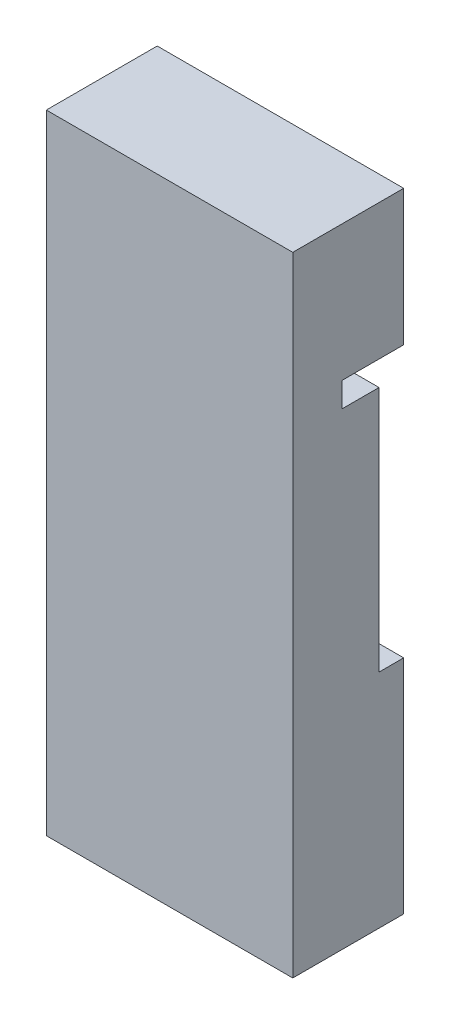
ISO-10303-21;
HEADER;
FILE_DESCRIPTION(('STEP AP214'),'2;1');
FILE_NAME('part.step','',(''),(''),'','','');
FILE_SCHEMA(('AUTOMOTIVE_DESIGN { 1 0 10303 214 1 1 1 1 }'));
ENDSEC;
DATA;
#1=APPLICATION_CONTEXT('core data for automotive mechanical design processes');
#2=APPLICATION_PROTOCOL_DEFINITION('international standard','automotive_design',2000,#1);
#3=PRODUCT_CONTEXT('',#1,'mechanical');
#4=PRODUCT('Part','Part','',(#3));
#5=PRODUCT_RELATED_PRODUCT_CATEGORY('part','',(#4));
#6=PRODUCT_DEFINITION_FORMATION('','',#4);
#7=PRODUCT_DEFINITION_CONTEXT('part definition',#1,'design');
#8=PRODUCT_DEFINITION('design','',#6,#7);
#9=PRODUCT_DEFINITION_SHAPE('','',#8);
#10=(LENGTH_UNIT() NAMED_UNIT(*) SI_UNIT(.MILLI.,.METRE.));
#11=(NAMED_UNIT(*) PLANE_ANGLE_UNIT() SI_UNIT($,.RADIAN.));
#12=(NAMED_UNIT(*) SI_UNIT($,.STERADIAN.) SOLID_ANGLE_UNIT());
#13=UNCERTAINTY_MEASURE_WITH_UNIT(LENGTH_MEASURE(1.E-05),#10,'distance_accuracy_value','');
#14=(GEOMETRIC_REPRESENTATION_CONTEXT(3) GLOBAL_UNCERTAINTY_ASSIGNED_CONTEXT((#13)) GLOBAL_UNIT_ASSIGNED_CONTEXT((#10,
#11,#12)) REPRESENTATION_CONTEXT('',''));
#15=CARTESIAN_POINT('',(0.,0.,0.));
#16=DIRECTION('',(0.,0.,1.));
#17=DIRECTION('',(1.,0.,0.));
#18=AXIS2_PLACEMENT_3D('',#15,#16,#17);
#19=CARTESIAN_POINT('',(-15.9031235431236,-45.9115384615385,0.));
#20=DIRECTION('',(0.,0.,1.));
#21=DIRECTION('',(1.,0.,0.));
#22=AXIS2_PLACEMENT_3D('',#19,#20,#21);
#23=PLANE('',#22);
#24=DIRECTION('',(0.,1.,0.));
#25=VECTOR('',#24,1.);
#26=CARTESIAN_POINT('',(4.09687645687643,5.08846153846154,0.));
#27=LINE('',#26,#25);
#28=CARTESIAN_POINT('',(4.09687645687643,-5.91153846153853,0.));
#29=VERTEX_POINT('',#28);
#30=CARTESIAN_POINT('',(4.09687645687643,5.08846153846154,0.));
#31=VERTEX_POINT('',#30);
#32=EDGE_CURVE('E65',#29,#31,#27,.T.);
#33=ORIENTED_EDGE('',*,*,#32,.F.);
#34=DIRECTION('',(1.,0.,0.));
#35=VECTOR('',#34,1.);
#36=CARTESIAN_POINT('',(-15.9041235431236,-5.91153846153853,0.));
#37=LINE('',#36,#35);
#38=CARTESIAN_POINT('',(-15.9031235431236,-5.91153846153853,0.));
#39=VERTEX_POINT('',#38);
#40=EDGE_CURVE('E156',#39,#29,#37,.T.);
#41=ORIENTED_EDGE('',*,*,#40,.F.);
#42=DIRECTION('',(0.,-1.,0.));
#43=VECTOR('',#42,1.);
#44=CARTESIAN_POINT('',(-15.9031235431236,5.08846153846154,0.));
#45=LINE('',#44,#43);
#46=CARTESIAN_POINT('',(-15.9031235431236,5.08846153846154,0.));
#47=VERTEX_POINT('',#46);
#48=EDGE_CURVE('E189',#47,#39,#45,.T.);
#49=ORIENTED_EDGE('',*,*,#48,.F.);
#50=DIRECTION('',(-1.,0.,0.));
#51=VECTOR('',#50,1.);
#52=CARTESIAN_POINT('',(-15.9031235431236,5.08846153846154,0.));
#53=LINE('',#52,#51);
#54=EDGE_CURVE('E71',#31,#47,#53,.T.);
#55=ORIENTED_EDGE('',*,*,#54,.F.);
#56=EDGE_LOOP('',(#33,#41,#49,#55));
#57=FACE_BOUND('',#56,.T.);
#58=ADVANCED_FACE('F30',(#57),#23,.F.);
#59=CARTESIAN_POINT('',(-15.9031235431236,5.08846153846154,9.));
#60=DIRECTION('',(1.,0.,0.));
#61=DIRECTION('',(0.,1.,0.));
#62=AXIS2_PLACEMENT_3D('',#59,#60,#61);
#63=PLANE('',#62);
#64=ORIENTED_EDGE('',*,*,#48,.T.);
#65=DIRECTION('',(0.,0.,-1.));
#66=VECTOR('',#65,1.);
#67=CARTESIAN_POINT('',(-15.9031235431236,-5.91153846153853,4.99999999999999));
#68=LINE('',#67,#66);
#69=CARTESIAN_POINT('',(-15.9031235431236,-5.91153846153853,4.99999999999999));
#70=VERTEX_POINT('',#69);
#71=EDGE_CURVE('E146',#70,#39,#68,.T.);
#72=ORIENTED_EDGE('',*,*,#71,.F.);
#73=DIRECTION('',(0.,1.,0.));
#74=VECTOR('',#73,1.);
#75=CARTESIAN_POINT('',(-15.9031235431236,-5.91153846153853,4.99999999999999));
#76=LINE('',#75,#74);
#77=CARTESIAN_POINT('',(-15.9031235431236,-7.91153846153853,4.99999999999999));
#78=VERTEX_POINT('',#77);
#79=EDGE_CURVE('E127',#78,#70,#76,.T.);
#80=ORIENTED_EDGE('',*,*,#79,.F.);
#81=DIRECTION('',(0.,0.,1.));
#82=VECTOR('',#81,1.);
#83=CARTESIAN_POINT('',(-15.9031235431236,-7.91153846153853,4.99999999999999));
#84=LINE('',#83,#82);
#85=CARTESIAN_POINT('',(-15.9031235431236,-7.91153846153853,0.));
#86=VERTEX_POINT('',#85);
#87=EDGE_CURVE('E137',#86,#78,#84,.T.);
#88=ORIENTED_EDGE('',*,*,#87,.F.);
#89=CARTESIAN_POINT('',(-15.9031235431236,-45.9115384615385,0.));
#90=VERTEX_POINT('',#89);
#91=EDGE_CURVE('E178',#86,#90,#45,.T.);
#92=ORIENTED_EDGE('',*,*,#91,.T.);
#93=DIRECTION('',(0.,0.,-1.));
#94=VECTOR('',#93,1.);
#95=CARTESIAN_POINT('',(-15.9031235431236,-45.9115384615385,9.));
#96=LINE('',#95,#94);
#97=CARTESIAN_POINT('',(-15.9031235431236,-45.9115384615385,9.));
#98=VERTEX_POINT('',#97);
#99=EDGE_CURVE('E11',#98,#90,#96,.T.);
#100=ORIENTED_EDGE('',*,*,#99,.F.);
#101=DIRECTION('',(0.,-1.,0.));
#102=VECTOR('',#101,1.);
#103=CARTESIAN_POINT('',(-15.9031235431236,5.08846153846154,9.));
#104=LINE('',#103,#102);
#105=CARTESIAN_POINT('',(-15.9031235431236,5.08846153846154,9.));
#106=VERTEX_POINT('',#105);
#107=EDGE_CURVE('E182',#106,#98,#104,.T.);
#108=ORIENTED_EDGE('',*,*,#107,.F.);
#109=DIRECTION('',(0.,0.,-1.));
#110=VECTOR('',#109,1.);
#111=CARTESIAN_POINT('',(-15.9031235431236,5.08846153846154,9.));
#112=LINE('',#111,#110);
#113=EDGE_CURVE('E188',#106,#47,#112,.T.);
#114=ORIENTED_EDGE('',*,*,#113,.T.);
#115=EDGE_LOOP('',(#64,#72,#80,#88,#92,#100,#108,#114));
#116=FACE_BOUND('',#115,.T.);
#117=ADVANCED_FACE('F32',(#116),#63,.F.);
#118=CARTESIAN_POINT('',(-15.9031235431236,-45.9115384615385,9.));
#119=DIRECTION('',(0.,1.,0.));
#120=DIRECTION('',(0.,0.,1.));
#121=AXIS2_PLACEMENT_3D('',#118,#119,#120);
#122=PLANE('',#121);
#123=DIRECTION('',(1.,0.,0.));
#124=VECTOR('',#123,1.);
#125=CARTESIAN_POINT('',(-15.9031235431236,-45.9115384615385,0.));
#126=LINE('',#125,#124);
#127=CARTESIAN_POINT('',(4.09687645687644,-45.9115384615385,0.));
#128=VERTEX_POINT('',#127);
#129=EDGE_CURVE('E191',#90,#128,#126,.T.);
#130=ORIENTED_EDGE('',*,*,#129,.T.);
#131=DIRECTION('',(0.,0.,-1.));
#132=VECTOR('',#131,1.);
#133=CARTESIAN_POINT('',(4.09687645687644,-45.9115384615385,9.));
#134=LINE('',#133,#132);
#135=CARTESIAN_POINT('',(4.09687645687644,-45.9115384615385,9.));
#136=VERTEX_POINT('',#135);
#137=EDGE_CURVE('E39',#136,#128,#134,.T.);
#138=ORIENTED_EDGE('',*,*,#137,.F.);
#139=DIRECTION('',(1.,0.,0.));
#140=VECTOR('',#139,1.);
#141=CARTESIAN_POINT('',(-15.9031235431236,-45.9115384615385,9.));
#142=LINE('',#141,#140);
#143=EDGE_CURVE('E78',#98,#136,#142,.T.);
#144=ORIENTED_EDGE('',*,*,#143,.F.);
#145=ORIENTED_EDGE('',*,*,#99,.T.);
#146=EDGE_LOOP('',(#130,#138,#144,#145));
#147=FACE_BOUND('',#146,.T.);
#148=ADVANCED_FACE('F236',(#147),#122,.F.);
#149=CARTESIAN_POINT('',(4.09687645687643,5.08846153846154,9.));
#150=DIRECTION('',(-1.,0.,0.));
#151=DIRECTION('',(0.,-1.,0.));
#152=AXIS2_PLACEMENT_3D('',#149,#150,#151);
#153=PLANE('',#152);
#154=DIRECTION('',(0.,-1.,0.));
#155=VECTOR('',#154,1.);
#156=CARTESIAN_POINT('',(4.09687645687643,-5.91153846153853,4.99999999999999));
#157=LINE('',#156,#155);
#158=CARTESIAN_POINT('',(4.09687645687643,-5.91153846153853,4.99999999999999));
#159=VERTEX_POINT('',#158);
#160=CARTESIAN_POINT('',(4.09687645687643,-7.91153846153852,4.99999999999999));
#161=VERTEX_POINT('',#160);
#162=EDGE_CURVE('E130',#159,#161,#157,.T.);
#163=ORIENTED_EDGE('',*,*,#162,.F.);
#164=DIRECTION('',(0.,0.,1.));
#165=VECTOR('',#164,1.);
#166=CARTESIAN_POINT('',(4.09687645687643,-5.91153846153853,4.99999999999999));
#167=LINE('',#166,#165);
#168=EDGE_CURVE('E134',#29,#159,#167,.T.);
#169=ORIENTED_EDGE('',*,*,#168,.F.);
#170=ORIENTED_EDGE('',*,*,#32,.T.);
#171=DIRECTION('',(0.,0.,-1.));
#172=VECTOR('',#171,1.);
#173=CARTESIAN_POINT('',(4.09687645687643,5.08846153846154,9.));
#174=LINE('',#173,#172);
#175=CARTESIAN_POINT('',(4.09687645687643,5.08846153846154,9.));
#176=VERTEX_POINT('',#175);
#177=EDGE_CURVE('E198',#176,#31,#174,.T.);
#178=ORIENTED_EDGE('',*,*,#177,.F.);
#179=DIRECTION('',(0.,1.,0.));
#180=VECTOR('',#179,1.);
#181=CARTESIAN_POINT('',(4.09687645687643,5.08846153846154,9.));
#182=LINE('',#181,#180);
#183=EDGE_CURVE('E185',#136,#176,#182,.T.);
#184=ORIENTED_EDGE('',*,*,#183,.F.);
#185=ORIENTED_EDGE('',*,*,#137,.T.);
#186=CARTESIAN_POINT('',(4.09687645687644,-27.9115384615385,0.));
#187=VERTEX_POINT('',#186);
#188=EDGE_CURVE('E193',#128,#187,#27,.T.);
#189=ORIENTED_EDGE('',*,*,#188,.T.);
#190=DIRECTION('',(0.,0.,-1.));
#191=VECTOR('',#190,1.);
#192=CARTESIAN_POINT('',(4.09687645687644,-27.9115384615385,2.));
#193=LINE('',#192,#191);
#194=CARTESIAN_POINT('',(4.09687645687644,-27.9115384615385,2.));
#195=VERTEX_POINT('',#194);
#196=EDGE_CURVE('E179',#195,#187,#193,.T.);
#197=ORIENTED_EDGE('',*,*,#196,.F.);
#198=DIRECTION('',(0.,-1.,0.));
#199=VECTOR('',#198,1.);
#200=CARTESIAN_POINT('',(4.09687645687644,-7.91153846153852,2.));
#201=LINE('',#200,#199);
#202=CARTESIAN_POINT('',(4.09687645687644,-7.91153846153852,2.));
#203=VERTEX_POINT('',#202);
#204=EDGE_CURVE('E166',#203,#195,#201,.T.);
#205=ORIENTED_EDGE('',*,*,#204,.F.);
#206=DIRECTION('',(0.,0.,-1.));
#207=VECTOR('',#206,1.);
#208=CARTESIAN_POINT('',(4.09687645687643,-7.91153846153852,4.99999999999999));
#209=LINE('',#208,#207);
#210=EDGE_CURVE('E151',#161,#203,#209,.T.);
#211=ORIENTED_EDGE('',*,*,#210,.F.);
#212=EDGE_LOOP('',(#163,#169,#170,#178,#184,#185,#189,#197,#205,#211));
#213=FACE_BOUND('',#212,.T.);
#214=ADVANCED_FACE('F202',(#213),#153,.F.);
#215=CARTESIAN_POINT('',(-15.9031235431236,5.08846153846154,9.));
#216=DIRECTION('',(0.,-1.,0.));
#217=DIRECTION('',(0.,0.,-1.));
#218=AXIS2_PLACEMENT_3D('',#215,#216,#217);
#219=PLANE('',#218);
#220=ORIENTED_EDGE('',*,*,#54,.T.);
#221=ORIENTED_EDGE('',*,*,#113,.F.);
#222=DIRECTION('',(-1.,0.,0.));
#223=VECTOR('',#222,1.);
#224=CARTESIAN_POINT('',(-15.9031235431236,5.08846153846154,9.));
#225=LINE('',#224,#223);
#226=EDGE_CURVE('E47',#176,#106,#225,.T.);
#227=ORIENTED_EDGE('',*,*,#226,.F.);
#228=ORIENTED_EDGE('',*,*,#177,.T.);
#229=EDGE_LOOP('',(#220,#221,#227,#228));
#230=FACE_BOUND('',#229,.T.);
#231=ADVANCED_FACE('F238',(#230),#219,.F.);
#232=CARTESIAN_POINT('',(-15.9031235431236,-45.9115384615385,9.));
#233=DIRECTION('',(0.,0.,1.));
#234=DIRECTION('',(1.,0.,0.));
#235=AXIS2_PLACEMENT_3D('',#232,#233,#234);
#236=PLANE('',#235);
#237=ORIENTED_EDGE('',*,*,#107,.T.);
#238=ORIENTED_EDGE('',*,*,#143,.T.);
#239=ORIENTED_EDGE('',*,*,#183,.T.);
#240=ORIENTED_EDGE('',*,*,#226,.T.);
#241=EDGE_LOOP('',(#237,#238,#239,#240));
#242=FACE_BOUND('',#241,.T.);
#243=ADVANCED_FACE('F227',(#242),#236,.T.);
#244=ORIENTED_EDGE('',*,*,#91,.F.);
#245=DIRECTION('',(1.,0.,0.));
#246=VECTOR('',#245,1.);
#247=CARTESIAN_POINT('',(-15.9041235431236,-7.91153846153853,0.));
#248=LINE('',#247,#246);
#249=CARTESIAN_POINT('',(-2.90312354312355,-7.91153846153853,0.));
#250=VERTEX_POINT('',#249);
#251=EDGE_CURVE('E133',#86,#250,#248,.T.);
#252=ORIENTED_EDGE('',*,*,#251,.T.);
#253=DIRECTION('',(0.,1.,0.));
#254=VECTOR('',#253,1.);
#255=CARTESIAN_POINT('',(-2.90312354312355,-7.91153846153852,0.));
#256=LINE('',#255,#254);
#257=CARTESIAN_POINT('',(-2.90312354312355,-27.9115384615385,0.));
#258=VERTEX_POINT('',#257);
#259=EDGE_CURVE('E142',#258,#250,#256,.T.);
#260=ORIENTED_EDGE('',*,*,#259,.F.);
#261=DIRECTION('',(-1.,0.,0.));
#262=VECTOR('',#261,1.);
#263=CARTESIAN_POINT('',(-2.90312354312355,-27.9115384615385,0.));
#264=LINE('',#263,#262);
#265=EDGE_CURVE('E163',#187,#258,#264,.T.);
#266=ORIENTED_EDGE('',*,*,#265,.F.);
#267=ORIENTED_EDGE('',*,*,#188,.F.);
#268=ORIENTED_EDGE('',*,*,#129,.F.);
#269=EDGE_LOOP('',(#244,#252,#260,#266,#267,#268));
#270=FACE_BOUND('',#269,.T.);
#271=ADVANCED_FACE('F207',(#270),#23,.F.);
#272=CARTESIAN_POINT('',(-2.90312354312355,-7.91153846153852,2.));
#273=DIRECTION('',(-1.,0.,0.));
#274=DIRECTION('',(0.,0.,1.));
#275=AXIS2_PLACEMENT_3D('',#272,#273,#274);
#276=PLANE('',#275);
#277=ORIENTED_EDGE('',*,*,#259,.T.);
#278=DIRECTION('',(0.,0.,-1.));
#279=VECTOR('',#278,1.);
#280=CARTESIAN_POINT('',(-2.90312354312355,-7.91153846153852,2.));
#281=LINE('',#280,#279);
#282=CARTESIAN_POINT('',(-2.90312354312355,-7.91153846153852,2.));
#283=VERTEX_POINT('',#282);
#284=EDGE_CURVE('E171',#283,#250,#281,.T.);
#285=ORIENTED_EDGE('',*,*,#284,.F.);
#286=DIRECTION('',(0.,1.,0.));
#287=VECTOR('',#286,1.);
#288=CARTESIAN_POINT('',(-2.90312354312355,-7.91153846153852,2.));
#289=LINE('',#288,#287);
#290=CARTESIAN_POINT('',(-2.90312354312355,-27.9115384615385,2.));
#291=VERTEX_POINT('',#290);
#292=EDGE_CURVE('E159',#291,#283,#289,.T.);
#293=ORIENTED_EDGE('',*,*,#292,.F.);
#294=DIRECTION('',(0.,0.,-1.));
#295=VECTOR('',#294,1.);
#296=CARTESIAN_POINT('',(-2.90312354312355,-27.9115384615385,2.));
#297=LINE('',#296,#295);
#298=EDGE_CURVE('E176',#291,#258,#297,.T.);
#299=ORIENTED_EDGE('',*,*,#298,.T.);
#300=EDGE_LOOP('',(#277,#285,#293,#299));
#301=FACE_BOUND('',#300,.T.);
#302=ADVANCED_FACE('F218',(#301),#276,.F.);
#303=CARTESIAN_POINT('',(-2.90312354312355,-27.9115384615385,2.));
#304=DIRECTION('',(0.,-1.,0.));
#305=DIRECTION('',(0.,0.,-1.));
#306=AXIS2_PLACEMENT_3D('',#303,#304,#305);
#307=PLANE('',#306);
#308=ORIENTED_EDGE('',*,*,#265,.T.);
#309=ORIENTED_EDGE('',*,*,#298,.F.);
#310=DIRECTION('',(-1.,0.,0.));
#311=VECTOR('',#310,1.);
#312=CARTESIAN_POINT('',(-2.90312354312355,-27.9115384615385,2.));
#313=LINE('',#312,#311);
#314=EDGE_CURVE('E168',#195,#291,#313,.T.);
#315=ORIENTED_EDGE('',*,*,#314,.F.);
#316=ORIENTED_EDGE('',*,*,#196,.T.);
#317=EDGE_LOOP('',(#308,#309,#315,#316));
#318=FACE_BOUND('',#317,.T.);
#319=ADVANCED_FACE('F210',(#318),#307,.F.);
#320=CARTESIAN_POINT('',(-2.90312354312355,-27.9115384615385,2.));
#321=DIRECTION('',(0.,0.,1.));
#322=DIRECTION('',(1.,0.,0.));
#323=AXIS2_PLACEMENT_3D('',#320,#321,#322);
#324=PLANE('',#323);
#325=ORIENTED_EDGE('',*,*,#292,.T.);
#326=DIRECTION('',(1.,0.,0.));
#327=VECTOR('',#326,1.);
#328=CARTESIAN_POINT('',(-2.90312354312355,-7.91153846153852,2.));
#329=LINE('',#328,#327);
#330=EDGE_CURVE('E162',#283,#203,#329,.T.);
#331=ORIENTED_EDGE('',*,*,#330,.T.);
#332=ORIENTED_EDGE('',*,*,#204,.T.);
#333=ORIENTED_EDGE('',*,*,#314,.T.);
#334=EDGE_LOOP('',(#325,#331,#332,#333));
#335=FACE_BOUND('',#334,.T.);
#336=ADVANCED_FACE('F215',(#335),#324,.F.);
#337=CARTESIAN_POINT('',(-15.9041235431236,-7.91153846153853,4.99999999999999));
#338=DIRECTION('',(0.,-1.,0.));
#339=DIRECTION('',(1.,0.,0.));
#340=AXIS2_PLACEMENT_3D('',#337,#338,#339);
#341=PLANE('',#340);
#342=ORIENTED_EDGE('',*,*,#251,.F.);
#343=ORIENTED_EDGE('',*,*,#87,.T.);
#344=DIRECTION('',(1.,0.,0.));
#345=VECTOR('',#344,1.);
#346=CARTESIAN_POINT('',(-15.9041235431236,-7.91153846153853,4.99999999999999));
#347=LINE('',#346,#345);
#348=EDGE_CURVE('E123',#78,#161,#347,.T.);
#349=ORIENTED_EDGE('',*,*,#348,.T.);
#350=ORIENTED_EDGE('',*,*,#210,.T.);
#351=ORIENTED_EDGE('',*,*,#330,.F.);
#352=ORIENTED_EDGE('',*,*,#284,.T.);
#353=EDGE_LOOP('',(#342,#343,#349,#350,#351,#352));
#354=FACE_BOUND('',#353,.T.);
#355=ADVANCED_FACE('F138',(#354),#341,.F.);
#356=CARTESIAN_POINT('',(-15.9041235431236,-5.91153846153853,4.99999999999999));
#357=DIRECTION('',(0.,0.,1.));
#358=DIRECTION('',(1.,0.,0.));
#359=AXIS2_PLACEMENT_3D('',#356,#357,#358);
#360=PLANE('',#359);
#361=ORIENTED_EDGE('',*,*,#79,.T.);
#362=DIRECTION('',(1.,0.,0.));
#363=VECTOR('',#362,1.);
#364=CARTESIAN_POINT('',(-15.9041235431236,-5.91153846153853,4.99999999999999));
#365=LINE('',#364,#363);
#366=EDGE_CURVE('E143',#70,#159,#365,.T.);
#367=ORIENTED_EDGE('',*,*,#366,.T.);
#368=ORIENTED_EDGE('',*,*,#162,.T.);
#369=ORIENTED_EDGE('',*,*,#348,.F.);
#370=EDGE_LOOP('',(#361,#367,#368,#369));
#371=FACE_BOUND('',#370,.T.);
#372=ADVANCED_FACE('F125',(#371),#360,.F.);
#373=CARTESIAN_POINT('',(-15.9041235431236,-5.91153846153853,4.99999999999999));
#374=DIRECTION('',(0.,1.,0.));
#375=DIRECTION('',(-1.,0.,0.));
#376=AXIS2_PLACEMENT_3D('',#373,#374,#375);
#377=PLANE('',#376);
#378=ORIENTED_EDGE('',*,*,#71,.T.);
#379=ORIENTED_EDGE('',*,*,#40,.T.);
#380=ORIENTED_EDGE('',*,*,#168,.T.);
#381=ORIENTED_EDGE('',*,*,#366,.F.);
#382=EDGE_LOOP('',(#378,#379,#380,#381));
#383=FACE_BOUND('',#382,.T.);
#384=ADVANCED_FACE('F252',(#383),#377,.F.);
#385=CLOSED_SHELL('',(#58,#117,#148,#214,#231,#243,#271,#302,#319,#336,#355,#372,#384));
#386=MANIFOLD_SOLID_BREP('B2',#385);
#387=ADVANCED_BREP_SHAPE_REPRESENTATION('',(#18,#386),#14);
#388=SHAPE_DEFINITION_REPRESENTATION(#9,#387);
ENDSEC;
END-ISO-10303-21;
